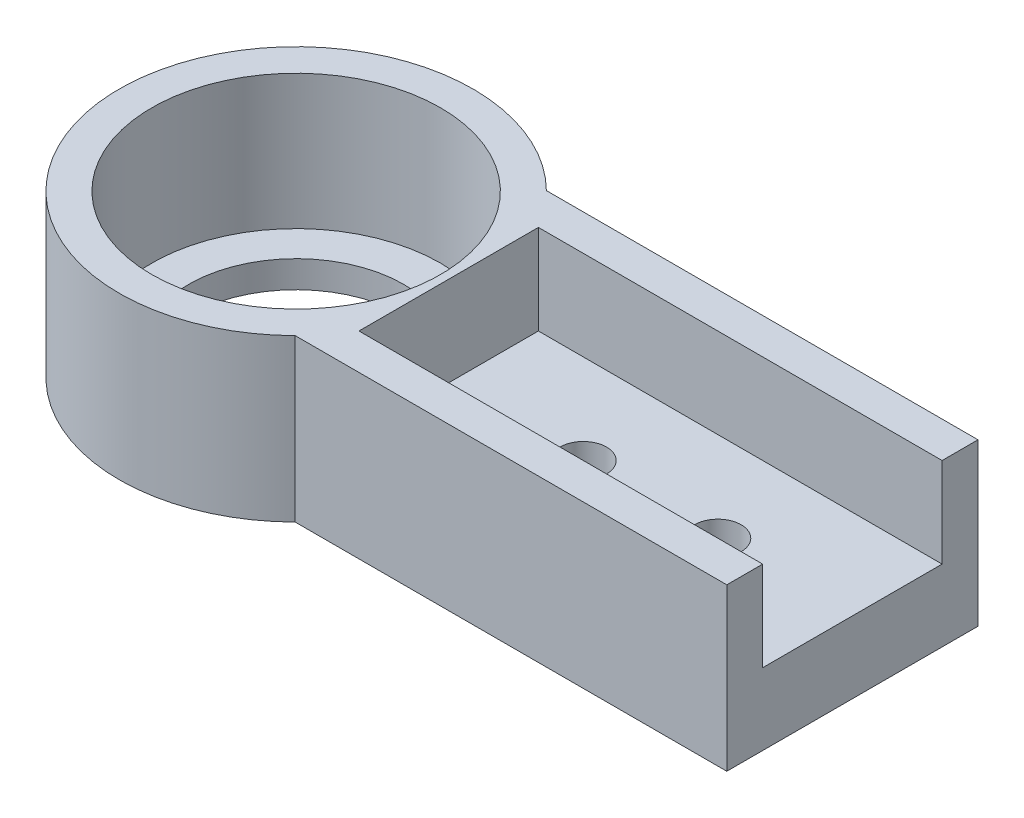
ISO-10303-21;
HEADER;
FILE_DESCRIPTION(('STEP AP214'),'2;1');
FILE_NAME('part.step','',(''),(''),'','','');
FILE_SCHEMA(('AUTOMOTIVE_DESIGN { 1 0 10303 214 1 1 1 1 }'));
ENDSEC;
DATA;
#1=APPLICATION_CONTEXT('core data for automotive mechanical design processes');
#2=APPLICATION_PROTOCOL_DEFINITION('international standard','automotive_design',2000,#1);
#3=PRODUCT_CONTEXT('',#1,'mechanical');
#4=PRODUCT('Part','Part','',(#3));
#5=PRODUCT_RELATED_PRODUCT_CATEGORY('part','',(#4));
#6=PRODUCT_DEFINITION_FORMATION('','',#4);
#7=PRODUCT_DEFINITION_CONTEXT('part definition',#1,'design');
#8=PRODUCT_DEFINITION('design','',#6,#7);
#9=PRODUCT_DEFINITION_SHAPE('','',#8);
#10=(LENGTH_UNIT() NAMED_UNIT(*) SI_UNIT(.MILLI.,.METRE.));
#11=(NAMED_UNIT(*) PLANE_ANGLE_UNIT() SI_UNIT($,.RADIAN.));
#12=(NAMED_UNIT(*) SI_UNIT($,.STERADIAN.) SOLID_ANGLE_UNIT());
#13=UNCERTAINTY_MEASURE_WITH_UNIT(LENGTH_MEASURE(1.E-05),#10,'distance_accuracy_value','');
#14=(GEOMETRIC_REPRESENTATION_CONTEXT(3) GLOBAL_UNCERTAINTY_ASSIGNED_CONTEXT((#13)) GLOBAL_UNIT_ASSIGNED_CONTEXT((#10,
#11,#12)) REPRESENTATION_CONTEXT('',''));
#15=CARTESIAN_POINT('',(0.,0.,0.));
#16=DIRECTION('',(0.,0.,1.));
#17=DIRECTION('',(1.,0.,0.));
#18=AXIS2_PLACEMENT_3D('',#15,#16,#17);
#19=CARTESIAN_POINT('',(0.,6.,-10.));
#20=DIRECTION('',(0.,0.,-1.));
#21=DIRECTION('',(-1.,0.,0.));
#22=AXIS2_PLACEMENT_3D('',#19,#20,#21);
#23=PLANE('',#22);
#24=DIRECTION('',(1.,0.,0.));
#25=VECTOR('',#24,1.);
#26=CARTESIAN_POINT('',(-3.1075560105502,16.,-10.));
#27=LINE('',#26,#25);
#28=CARTESIAN_POINT('',(0.,16.,-10.));
#29=VERTEX_POINT('',#28);
#30=CARTESIAN_POINT('',(45.,16.,-10.));
#31=VERTEX_POINT('',#30);
#32=EDGE_CURVE('E189',#29,#31,#27,.T.);
#33=ORIENTED_EDGE('',*,*,#32,.F.);
#34=DIRECTION('',(0.,1.,0.));
#35=VECTOR('',#34,1.);
#36=CARTESIAN_POINT('',(0.,6.,-10.));
#37=LINE('',#36,#35);
#38=CARTESIAN_POINT('',(0.,6.,-10.));
#39=VERTEX_POINT('',#38);
#40=EDGE_CURVE('E175',#39,#29,#37,.T.);
#41=ORIENTED_EDGE('',*,*,#40,.F.);
#42=DIRECTION('',(-1.,0.,0.));
#43=VECTOR('',#42,1.);
#44=CARTESIAN_POINT('',(0.,6.,-10.));
#45=LINE('',#44,#43);
#46=CARTESIAN_POINT('',(45.,6.,-10.));
#47=VERTEX_POINT('',#46);
#48=EDGE_CURVE('E170',#47,#39,#45,.T.);
#49=ORIENTED_EDGE('',*,*,#48,.F.);
#50=DIRECTION('',(0.,1.,0.));
#51=VECTOR('',#50,1.);
#52=CARTESIAN_POINT('',(45.,6.,-10.));
#53=LINE('',#52,#51);
#54=EDGE_CURVE('E118',#47,#31,#53,.T.);
#55=ORIENTED_EDGE('',*,*,#54,.T.);
#56=EDGE_LOOP('',(#33,#41,#49,#55));
#57=FACE_BOUND('',#56,.T.);
#58=ADVANCED_FACE('F92',(#57),#23,.F.);
#59=CARTESIAN_POINT('',(0.,6.,10.));
#60=DIRECTION('',(0.,0.,1.));
#61=DIRECTION('',(1.,0.,0.));
#62=AXIS2_PLACEMENT_3D('',#59,#60,#61);
#63=PLANE('',#62);
#64=DIRECTION('',(0.,1.,0.));
#65=VECTOR('',#64,1.);
#66=CARTESIAN_POINT('',(0.,6.,10.));
#67=LINE('',#66,#65);
#68=CARTESIAN_POINT('',(0.,6.,10.));
#69=VERTEX_POINT('',#68);
#70=CARTESIAN_POINT('',(0.,16.,10.));
#71=VERTEX_POINT('',#70);
#72=EDGE_CURVE('E160',#69,#71,#67,.T.);
#73=ORIENTED_EDGE('',*,*,#72,.T.);
#74=DIRECTION('',(-1.,0.,0.));
#75=VECTOR('',#74,1.);
#76=CARTESIAN_POINT('',(-3.1075560105502,16.,10.));
#77=LINE('',#76,#75);
#78=CARTESIAN_POINT('',(45.,16.,10.));
#79=VERTEX_POINT('',#78);
#80=EDGE_CURVE('E165',#79,#71,#77,.T.);
#81=ORIENTED_EDGE('',*,*,#80,.F.);
#82=DIRECTION('',(0.,1.,0.));
#83=VECTOR('',#82,1.);
#84=CARTESIAN_POINT('',(45.,6.,10.));
#85=LINE('',#84,#83);
#86=CARTESIAN_POINT('',(45.,6.,10.));
#87=VERTEX_POINT('',#86);
#88=EDGE_CURVE('E169',#87,#79,#85,.T.);
#89=ORIENTED_EDGE('',*,*,#88,.F.);
#90=DIRECTION('',(1.,0.,0.));
#91=VECTOR('',#90,1.);
#92=CARTESIAN_POINT('',(0.,6.,10.));
#93=LINE('',#92,#91);
#94=EDGE_CURVE('E167',#69,#87,#93,.T.);
#95=ORIENTED_EDGE('',*,*,#94,.F.);
#96=EDGE_LOOP('',(#73,#81,#89,#95));
#97=FACE_BOUND('',#96,.T.);
#98=ADVANCED_FACE('F162',(#97),#63,.F.);
#99=CARTESIAN_POINT('',(30.,-5.,0.));
#100=DIRECTION('',(0.,1.,0.));
#101=DIRECTION('',(0.,0.,1.));
#102=AXIS2_PLACEMENT_3D('',#99,#100,#101);
#103=CYLINDRICAL_SURFACE('',#102,2.6);
#104=CARTESIAN_POINT('',(30.,6.,0.));
#105=DIRECTION('',(0.,1.,0.));
#106=DIRECTION('',(0.,0.,1.));
#107=AXIS2_PLACEMENT_3D('',#104,#105,#106);
#108=CIRCLE('',#107,2.6);
#109=CARTESIAN_POINT('',(30.,6.,2.6));
#110=VERTEX_POINT('',#109);
#111=EDGE_CURVE('E255',#110,#110,#108,.T.);
#112=ORIENTED_EDGE('',*,*,#111,.T.);
#113=EDGE_LOOP('',(#112));
#114=FACE_BOUND('',#113,.T.);
#115=CARTESIAN_POINT('',(30.,3.,0.));
#116=DIRECTION('',(0.,-1.,0.));
#117=DIRECTION('',(0.,0.,-1.));
#118=AXIS2_PLACEMENT_3D('',#115,#116,#117);
#119=CIRCLE('',#118,2.6);
#120=CARTESIAN_POINT('',(30.,3.,-2.59999999999999));
#121=VERTEX_POINT('',#120);
#122=EDGE_CURVE('E96',#121,#121,#119,.F.);
#123=ORIENTED_EDGE('',*,*,#122,.F.);
#124=EDGE_LOOP('',(#123));
#125=FACE_BOUND('',#124,.T.);
#126=ADVANCED_FACE('F292',(#114,#125),#103,.F.);
#127=CARTESIAN_POINT('',(15.,-5.,0.));
#128=DIRECTION('',(0.,1.,0.));
#129=DIRECTION('',(0.,0.,1.));
#130=AXIS2_PLACEMENT_3D('',#127,#128,#129);
#131=CYLINDRICAL_SURFACE('',#130,2.6);
#132=CARTESIAN_POINT('',(15.,6.,0.));
#133=DIRECTION('',(0.,1.,0.));
#134=DIRECTION('',(0.,0.,1.));
#135=AXIS2_PLACEMENT_3D('',#132,#133,#134);
#136=CIRCLE('',#135,2.6);
#137=CARTESIAN_POINT('',(15.,6.,2.6));
#138=VERTEX_POINT('',#137);
#139=EDGE_CURVE('E250',#138,#138,#136,.T.);
#140=ORIENTED_EDGE('',*,*,#139,.T.);
#141=EDGE_LOOP('',(#140));
#142=FACE_BOUND('',#141,.T.);
#143=CARTESIAN_POINT('',(15.,3.,0.));
#144=DIRECTION('',(0.,-1.,0.));
#145=DIRECTION('',(0.,0.,-1.));
#146=AXIS2_PLACEMENT_3D('',#143,#144,#145);
#147=CIRCLE('',#146,2.6);
#148=CARTESIAN_POINT('',(15.,3.,-2.6));
#149=VERTEX_POINT('',#148);
#150=EDGE_CURVE('E246',#149,#149,#147,.F.);
#151=ORIENTED_EDGE('',*,*,#150,.F.);
#152=EDGE_LOOP('',(#151));
#153=FACE_BOUND('',#152,.T.);
#154=ADVANCED_FACE('F294',(#142,#153),#131,.F.);
#155=CARTESIAN_POINT('',(0.,11.,-14.));
#156=DIRECTION('',(0.,0.,1.));
#157=DIRECTION('',(1.,0.,0.));
#158=AXIS2_PLACEMENT_3D('',#155,#156,#157);
#159=PLANE('',#158);
#160=DIRECTION('',(0.,1.,0.));
#161=VECTOR('',#160,1.);
#162=CARTESIAN_POINT('',(45.,0.,-14.));
#163=LINE('',#162,#161);
#164=CARTESIAN_POINT('',(45.,-2.,-14.));
#165=VERTEX_POINT('',#164);
#166=CARTESIAN_POINT('',(45.,16.,-14.));
#167=VERTEX_POINT('',#166);
#168=EDGE_CURVE('E259',#165,#167,#163,.T.);
#169=ORIENTED_EDGE('',*,*,#168,.F.);
#170=DIRECTION('',(-1.,0.,0.));
#171=VECTOR('',#170,1.);
#172=CARTESIAN_POINT('',(45.,-2.,-14.));
#173=LINE('',#172,#171);
#174=CARTESIAN_POINT('',(-3.1075560105502,-2.,-14.));
#175=VERTEX_POINT('',#174);
#176=EDGE_CURVE('E225',#165,#175,#173,.T.);
#177=ORIENTED_EDGE('',*,*,#176,.T.);
#178=DIRECTION('',(0.,-1.,0.));
#179=VECTOR('',#178,1.);
#180=CARTESIAN_POINT('',(-3.1075560105502,11.,-14.));
#181=LINE('',#180,#179);
#182=CARTESIAN_POINT('',(-3.1075560105502,16.,-14.));
#183=VERTEX_POINT('',#182);
#184=EDGE_CURVE('E12',#183,#175,#181,.T.);
#185=ORIENTED_EDGE('',*,*,#184,.F.);
#186=DIRECTION('',(-1.,0.,0.));
#187=VECTOR('',#186,1.);
#188=CARTESIAN_POINT('',(-3.1075560105502,16.,-14.));
#189=LINE('',#188,#187);
#190=EDGE_CURVE('E201',#167,#183,#189,.T.);
#191=ORIENTED_EDGE('',*,*,#190,.F.);
#192=EDGE_LOOP('',(#169,#177,#185,#191));
#193=FACE_BOUND('',#192,.T.);
#194=ADVANCED_FACE('F94',(#193),#159,.F.);
#195=CARTESIAN_POINT('',(0.,11.,14.));
#196=DIRECTION('',(0.,0.,1.));
#197=DIRECTION('',(1.,0.,0.));
#198=AXIS2_PLACEMENT_3D('',#195,#196,#197);
#199=PLANE('',#198);
#200=DIRECTION('',(0.,-1.,0.));
#201=VECTOR('',#200,1.);
#202=CARTESIAN_POINT('',(-3.1075560105502,11.,14.));
#203=LINE('',#202,#201);
#204=CARTESIAN_POINT('',(-3.1075560105502,16.,14.));
#205=VERTEX_POINT('',#204);
#206=CARTESIAN_POINT('',(-3.10755601055019,-2.,14.));
#207=VERTEX_POINT('',#206);
#208=EDGE_CURVE('E102',#205,#207,#203,.T.);
#209=ORIENTED_EDGE('',*,*,#208,.T.);
#210=DIRECTION('',(1.,0.,0.));
#211=VECTOR('',#210,1.);
#212=CARTESIAN_POINT('',(-3.1075560105502,-2.,14.));
#213=LINE('',#212,#211);
#214=CARTESIAN_POINT('',(45.,-2.,14.));
#215=VERTEX_POINT('',#214);
#216=EDGE_CURVE('E233',#207,#215,#213,.T.);
#217=ORIENTED_EDGE('',*,*,#216,.T.);
#218=DIRECTION('',(0.,1.,0.));
#219=VECTOR('',#218,1.);
#220=CARTESIAN_POINT('',(45.,0.,14.));
#221=LINE('',#220,#219);
#222=CARTESIAN_POINT('',(45.,16.,14.));
#223=VERTEX_POINT('',#222);
#224=EDGE_CURVE('E254',#215,#223,#221,.T.);
#225=ORIENTED_EDGE('',*,*,#224,.T.);
#226=DIRECTION('',(1.,0.,0.));
#227=VECTOR('',#226,1.);
#228=CARTESIAN_POINT('',(-3.1075560105502,16.,14.));
#229=LINE('',#228,#227);
#230=EDGE_CURVE('E179',#205,#223,#229,.T.);
#231=ORIENTED_EDGE('',*,*,#230,.F.);
#232=EDGE_LOOP('',(#209,#217,#225,#231));
#233=FACE_BOUND('',#232,.T.);
#234=ADVANCED_FACE('F313',(#233),#199,.T.);
#235=CARTESIAN_POINT('',(-17.,11.,0.));
#236=DIRECTION('',(0.,-1.,0.));
#237=DIRECTION('',(0.,0.,-1.));
#238=AXIS2_PLACEMENT_3D('',#235,#236,#237);
#239=CYLINDRICAL_SURFACE('',#238,19.723082923316);
#240=ORIENTED_EDGE('',*,*,#184,.T.);
#241=CARTESIAN_POINT('',(-17.,-2.,0.));
#242=DIRECTION('',(0.,-1.,0.));
#243=DIRECTION('',(0.,0.,-1.));
#244=AXIS2_PLACEMENT_3D('',#241,#242,#243);
#245=CIRCLE('',#244,19.723082923316);
#246=EDGE_CURVE('E229',#207,#175,#245,.T.);
#247=ORIENTED_EDGE('',*,*,#246,.F.);
#248=ORIENTED_EDGE('',*,*,#208,.F.);
#249=CARTESIAN_POINT('',(-17.,16.,0.));
#250=DIRECTION('',(0.,1.,0.));
#251=DIRECTION('',(0.,0.,1.));
#252=AXIS2_PLACEMENT_3D('',#249,#250,#251);
#253=CIRCLE('',#252,19.723082923316);
#254=EDGE_CURVE('E180',#183,#205,#253,.T.);
#255=ORIENTED_EDGE('',*,*,#254,.F.);
#256=EDGE_LOOP('',(#240,#247,#248,#255));
#257=FACE_BOUND('',#256,.T.);
#258=ADVANCED_FACE('F315',(#257),#239,.T.);
#259=CARTESIAN_POINT('',(0.,6.,0.));
#260=DIRECTION('',(-1.,0.,0.));
#261=DIRECTION('',(0.,0.,1.));
#262=AXIS2_PLACEMENT_3D('',#259,#260,#261);
#263=PLANE('',#262);
#264=ORIENTED_EDGE('',*,*,#40,.T.);
#265=DIRECTION('',(0.,0.,-1.));
#266=VECTOR('',#265,1.);
#267=CARTESIAN_POINT('',(0.,16.,-10.));
#268=LINE('',#267,#266);
#269=EDGE_CURVE('E173',#71,#29,#268,.T.);
#270=ORIENTED_EDGE('',*,*,#269,.F.);
#271=ORIENTED_EDGE('',*,*,#72,.F.);
#272=DIRECTION('',(0.,0.,1.));
#273=VECTOR('',#272,1.);
#274=CARTESIAN_POINT('',(0.,6.,0.));
#275=LINE('',#274,#273);
#276=EDGE_CURVE('E110',#39,#69,#275,.T.);
#277=ORIENTED_EDGE('',*,*,#276,.F.);
#278=EDGE_LOOP('',(#264,#270,#271,#277));
#279=FACE_BOUND('',#278,.T.);
#280=ADVANCED_FACE('F174',(#279),#263,.F.);
#281=CARTESIAN_POINT('',(0.,6.,0.));
#282=DIRECTION('',(0.,1.,0.));
#283=DIRECTION('',(0.,0.,1.));
#284=AXIS2_PLACEMENT_3D('',#281,#282,#283);
#285=PLANE('',#284);
#286=ORIENTED_EDGE('',*,*,#139,.F.);
#287=EDGE_LOOP('',(#286));
#288=FACE_BOUND('',#287,.T.);
#289=ORIENTED_EDGE('',*,*,#111,.F.);
#290=EDGE_LOOP('',(#289));
#291=FACE_BOUND('',#290,.T.);
#292=ORIENTED_EDGE('',*,*,#276,.T.);
#293=ORIENTED_EDGE('',*,*,#94,.T.);
#294=DIRECTION('',(0.,0.,-1.));
#295=VECTOR('',#294,1.);
#296=CARTESIAN_POINT('',(45.,6.,10.));
#297=LINE('',#296,#295);
#298=EDGE_CURVE('E268',#87,#47,#297,.T.);
#299=ORIENTED_EDGE('',*,*,#298,.T.);
#300=ORIENTED_EDGE('',*,*,#48,.T.);
#301=EDGE_LOOP('',(#292,#293,#299,#300));
#302=FACE_BOUND('',#301,.T.);
#303=ADVANCED_FACE('F322',(#288,#291,#302),#285,.T.);
#304=CARTESIAN_POINT('',(45.,0.,0.));
#305=DIRECTION('',(1.,0.,0.));
#306=DIRECTION('',(0.,0.,-1.));
#307=AXIS2_PLACEMENT_3D('',#304,#305,#306);
#308=PLANE('',#307);
#309=ORIENTED_EDGE('',*,*,#54,.F.);
#310=ORIENTED_EDGE('',*,*,#298,.F.);
#311=ORIENTED_EDGE('',*,*,#88,.T.);
#312=DIRECTION('',(0.,0.,-1.));
#313=VECTOR('',#312,1.);
#314=CARTESIAN_POINT('',(45.,16.,14.));
#315=LINE('',#314,#313);
#316=EDGE_CURVE('E187',#223,#79,#315,.T.);
#317=ORIENTED_EDGE('',*,*,#316,.F.);
#318=ORIENTED_EDGE('',*,*,#224,.F.);
#319=DIRECTION('',(0.,0.,-1.));
#320=VECTOR('',#319,1.);
#321=CARTESIAN_POINT('',(45.,-2.,14.));
#322=LINE('',#321,#320);
#323=EDGE_CURVE('E221',#215,#165,#322,.T.);
#324=ORIENTED_EDGE('',*,*,#323,.T.);
#325=ORIENTED_EDGE('',*,*,#168,.T.);
#326=DIRECTION('',(0.,0.,-1.));
#327=VECTOR('',#326,1.);
#328=CARTESIAN_POINT('',(45.,16.,-14.));
#329=LINE('',#328,#327);
#330=EDGE_CURVE('E193',#31,#167,#329,.T.);
#331=ORIENTED_EDGE('',*,*,#330,.F.);
#332=EDGE_LOOP('',(#309,#310,#311,#317,#318,#324,#325,#331));
#333=FACE_BOUND('',#332,.T.);
#334=ADVANCED_FACE('F334',(#333),#308,.T.);
#335=CARTESIAN_POINT('',(15.,3.,0.));
#336=DIRECTION('',(0.,-1.,0.));
#337=DIRECTION('',(0.,0.,-1.));
#338=AXIS2_PLACEMENT_3D('',#335,#336,#337);
#339=PLANE('',#338);
#340=CARTESIAN_POINT('',(15.,3.,0.));
#341=DIRECTION('',(0.,-1.,0.));
#342=DIRECTION('',(0.,0.,-1.));
#343=AXIS2_PLACEMENT_3D('',#340,#341,#342);
#344=CIRCLE('',#343,5.);
#345=CARTESIAN_POINT('',(15.,3.,-5.));
#346=VERTEX_POINT('',#345);
#347=EDGE_CURVE('E242',#346,#346,#344,.T.);
#348=ORIENTED_EDGE('',*,*,#347,.T.);
#349=EDGE_LOOP('',(#348));
#350=FACE_BOUND('',#349,.T.);
#351=ORIENTED_EDGE('',*,*,#150,.T.);
#352=EDGE_LOOP('',(#351));
#353=FACE_BOUND('',#352,.T.);
#354=ADVANCED_FACE('F367',(#350,#353),#339,.T.);
#355=CARTESIAN_POINT('',(15.,3.,0.));
#356=DIRECTION('',(0.,-1.,0.));
#357=DIRECTION('',(0.,0.,-1.));
#358=AXIS2_PLACEMENT_3D('',#355,#356,#357);
#359=CYLINDRICAL_SURFACE('',#358,5.);
#360=ORIENTED_EDGE('',*,*,#347,.F.);
#361=EDGE_LOOP('',(#360));
#362=FACE_BOUND('',#361,.T.);
#363=CARTESIAN_POINT('',(15.,-2.,0.));
#364=DIRECTION('',(0.,-1.,0.));
#365=DIRECTION('',(0.,0.,-1.));
#366=AXIS2_PLACEMENT_3D('',#363,#364,#365);
#367=CIRCLE('',#366,5.);
#368=CARTESIAN_POINT('',(15.,-2.,-5.));
#369=VERTEX_POINT('',#368);
#370=EDGE_CURVE('E213',#369,#369,#367,.T.);
#371=ORIENTED_EDGE('',*,*,#370,.T.);
#372=EDGE_LOOP('',(#371));
#373=FACE_BOUND('',#372,.T.);
#374=ADVANCED_FACE('F370',(#362,#373),#359,.F.);
#375=CARTESIAN_POINT('',(30.,3.,0.));
#376=DIRECTION('',(0.,-1.,0.));
#377=DIRECTION('',(0.,0.,-1.));
#378=AXIS2_PLACEMENT_3D('',#375,#376,#377);
#379=PLANE('',#378);
#380=CARTESIAN_POINT('',(30.,3.,0.));
#381=DIRECTION('',(0.,-1.,0.));
#382=DIRECTION('',(0.,0.,-1.));
#383=AXIS2_PLACEMENT_3D('',#380,#381,#382);
#384=CIRCLE('',#383,5.);
#385=CARTESIAN_POINT('',(30.,3.,-5.));
#386=VERTEX_POINT('',#385);
#387=EDGE_CURVE('E241',#386,#386,#384,.T.);
#388=ORIENTED_EDGE('',*,*,#387,.T.);
#389=EDGE_LOOP('',(#388));
#390=FACE_BOUND('',#389,.T.);
#391=ORIENTED_EDGE('',*,*,#122,.T.);
#392=EDGE_LOOP('',(#391));
#393=FACE_BOUND('',#392,.T.);
#394=ADVANCED_FACE('F290',(#390,#393),#379,.T.);
#395=CARTESIAN_POINT('',(30.,3.,0.));
#396=DIRECTION('',(0.,-1.,0.));
#397=DIRECTION('',(0.,0.,-1.));
#398=AXIS2_PLACEMENT_3D('',#395,#396,#397);
#399=CYLINDRICAL_SURFACE('',#398,5.);
#400=ORIENTED_EDGE('',*,*,#387,.F.);
#401=EDGE_LOOP('',(#400));
#402=FACE_BOUND('',#401,.T.);
#403=CARTESIAN_POINT('',(30.,-2.,0.));
#404=DIRECTION('',(0.,-1.,0.));
#405=DIRECTION('',(0.,0.,-1.));
#406=AXIS2_PLACEMENT_3D('',#403,#404,#405);
#407=CIRCLE('',#406,5.);
#408=CARTESIAN_POINT('',(30.,-2.,-5.));
#409=VERTEX_POINT('',#408);
#410=EDGE_CURVE('E209',#409,#409,#407,.T.);
#411=ORIENTED_EDGE('',*,*,#410,.T.);
#412=EDGE_LOOP('',(#411));
#413=FACE_BOUND('',#412,.T.);
#414=ADVANCED_FACE('F365',(#402,#413),#399,.F.);
#415=CARTESIAN_POINT('',(-17.,1.,0.));
#416=DIRECTION('',(0.,-1.,0.));
#417=DIRECTION('',(0.,0.,-1.));
#418=AXIS2_PLACEMENT_3D('',#415,#416,#417);
#419=PLANE('',#418);
#420=CARTESIAN_POINT('',(-17.,1.,0.));
#421=DIRECTION('',(0.,-1.,0.));
#422=DIRECTION('',(0.,0.,-1.));
#423=AXIS2_PLACEMENT_3D('',#420,#421,#422);
#424=CIRCLE('',#423,12.);
#425=CARTESIAN_POINT('',(-17.,1.,-12.));
#426=VERTEX_POINT('',#425);
#427=EDGE_CURVE('E237',#426,#426,#424,.T.);
#428=ORIENTED_EDGE('',*,*,#427,.T.);
#429=EDGE_LOOP('',(#428));
#430=FACE_BOUND('',#429,.T.);
#431=CARTESIAN_POINT('',(-17.,0.999999999999999,0.));
#432=DIRECTION('',(0.,1.,0.));
#433=DIRECTION('',(0.,0.,1.));
#434=AXIS2_PLACEMENT_3D('',#431,#432,#433);
#435=CIRCLE('',#434,16.1);
#436=CARTESIAN_POINT('',(-17.,0.999999999999999,16.1));
#437=VERTEX_POINT('',#436);
#438=EDGE_CURVE('E205',#437,#437,#435,.T.);
#439=ORIENTED_EDGE('',*,*,#438,.T.);
#440=EDGE_LOOP('',(#439));
#441=FACE_BOUND('',#440,.T.);
#442=ADVANCED_FACE('F361',(#430,#441),#419,.F.);
#443=CARTESIAN_POINT('',(-17.,1.,0.));
#444=DIRECTION('',(0.,-1.,0.));
#445=DIRECTION('',(0.,0.,-1.));
#446=AXIS2_PLACEMENT_3D('',#443,#444,#445);
#447=CYLINDRICAL_SURFACE('',#446,12.);
#448=ORIENTED_EDGE('',*,*,#427,.F.);
#449=EDGE_LOOP('',(#448));
#450=FACE_BOUND('',#449,.T.);
#451=CARTESIAN_POINT('',(-17.,-2.,0.));
#452=DIRECTION('',(0.,-1.,0.));
#453=DIRECTION('',(0.,0.,-1.));
#454=AXIS2_PLACEMENT_3D('',#451,#452,#453);
#455=CIRCLE('',#454,12.);
#456=CARTESIAN_POINT('',(-17.,-2.,-12.));
#457=VERTEX_POINT('',#456);
#458=EDGE_CURVE('E217',#457,#457,#455,.T.);
#459=ORIENTED_EDGE('',*,*,#458,.T.);
#460=EDGE_LOOP('',(#459));
#461=FACE_BOUND('',#460,.T.);
#462=ADVANCED_FACE('F357',(#450,#461),#447,.F.);
#463=CARTESIAN_POINT('',(-17.,-2.,0.));
#464=DIRECTION('',(0.,-1.,0.));
#465=DIRECTION('',(0.,0.,-1.));
#466=AXIS2_PLACEMENT_3D('',#463,#464,#465);
#467=PLANE('',#466);
#468=ORIENTED_EDGE('',*,*,#370,.F.);
#469=EDGE_LOOP('',(#468));
#470=FACE_BOUND('',#469,.T.);
#471=ORIENTED_EDGE('',*,*,#323,.F.);
#472=ORIENTED_EDGE('',*,*,#216,.F.);
#473=ORIENTED_EDGE('',*,*,#246,.T.);
#474=ORIENTED_EDGE('',*,*,#176,.F.);
#475=EDGE_LOOP('',(#471,#472,#473,#474));
#476=FACE_BOUND('',#475,.T.);
#477=ORIENTED_EDGE('',*,*,#458,.F.);
#478=EDGE_LOOP('',(#477));
#479=FACE_BOUND('',#478,.T.);
#480=ORIENTED_EDGE('',*,*,#410,.F.);
#481=EDGE_LOOP('',(#480));
#482=FACE_BOUND('',#481,.T.);
#483=ADVANCED_FACE('F332',(#470,#476,#479,#482),#467,.T.);
#484=CARTESIAN_POINT('',(-17.,0.999999999999999,0.));
#485=DIRECTION('',(0.,1.,0.));
#486=DIRECTION('',(0.,0.,1.));
#487=AXIS2_PLACEMENT_3D('',#484,#485,#486);
#488=CYLINDRICAL_SURFACE('',#487,16.1);
#489=ORIENTED_EDGE('',*,*,#438,.F.);
#490=EDGE_LOOP('',(#489));
#491=FACE_BOUND('',#490,.T.);
#492=CARTESIAN_POINT('',(-17.,16.,0.));
#493=DIRECTION('',(0.,1.,0.));
#494=DIRECTION('',(0.,0.,1.));
#495=AXIS2_PLACEMENT_3D('',#492,#493,#494);
#496=CIRCLE('',#495,16.1);
#497=CARTESIAN_POINT('',(-17.,16.,16.1));
#498=VERTEX_POINT('',#497);
#499=EDGE_CURVE('E338',#498,#498,#496,.T.);
#500=ORIENTED_EDGE('',*,*,#499,.T.);
#501=EDGE_LOOP('',(#500));
#502=FACE_BOUND('',#501,.T.);
#503=ADVANCED_FACE('F346',(#491,#502),#488,.F.);
#504=CARTESIAN_POINT('',(0.,16.,0.));
#505=DIRECTION('',(0.,1.,0.));
#506=DIRECTION('',(0.,0.,1.));
#507=AXIS2_PLACEMENT_3D('',#504,#505,#506);
#508=PLANE('',#507);
#509=ORIENTED_EDGE('',*,*,#269,.T.);
#510=ORIENTED_EDGE('',*,*,#32,.T.);
#511=ORIENTED_EDGE('',*,*,#330,.T.);
#512=ORIENTED_EDGE('',*,*,#190,.T.);
#513=ORIENTED_EDGE('',*,*,#254,.T.);
#514=ORIENTED_EDGE('',*,*,#230,.T.);
#515=ORIENTED_EDGE('',*,*,#316,.T.);
#516=ORIENTED_EDGE('',*,*,#80,.T.);
#517=EDGE_LOOP('',(#509,#510,#511,#512,#513,#514,#515,#516));
#518=FACE_BOUND('',#517,.T.);
#519=ORIENTED_EDGE('',*,*,#499,.F.);
#520=EDGE_LOOP('',(#519));
#521=FACE_BOUND('',#520,.T.);
#522=ADVANCED_FACE('F183',(#518,#521),#508,.T.);
#523=CLOSED_SHELL('',(#58,#98,#126,#154,#194,#234,#258,#280,#303,#334,#354,#374,#394,#414,#442,
#462,#483,#503,#522));
#524=MANIFOLD_SOLID_BREP('B2',#523);
#525=ADVANCED_BREP_SHAPE_REPRESENTATION('',(#18,#524),#14);
#526=SHAPE_DEFINITION_REPRESENTATION(#9,#525);
ENDSEC;
END-ISO-10303-21;
